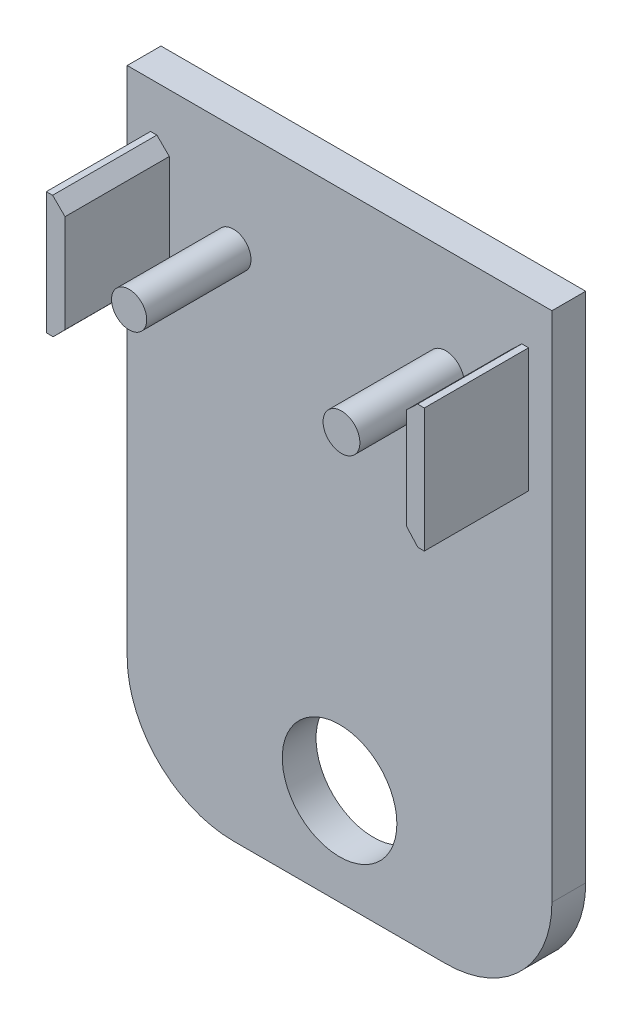
ISO-10303-21;
HEADER;
FILE_DESCRIPTION(('STEP AP214'),'2;1');
FILE_NAME('part.step','',(''),(''),'','','');
FILE_SCHEMA(('AUTOMOTIVE_DESIGN { 1 0 10303 214 1 1 1 1 }'));
ENDSEC;
DATA;
#1=APPLICATION_CONTEXT('core data for automotive mechanical design processes');
#2=APPLICATION_PROTOCOL_DEFINITION('international standard','automotive_design',2000,#1);
#3=PRODUCT_CONTEXT('',#1,'mechanical');
#4=PRODUCT('Part','Part','',(#3));
#5=PRODUCT_RELATED_PRODUCT_CATEGORY('part','',(#4));
#6=PRODUCT_DEFINITION_FORMATION('','',#4);
#7=PRODUCT_DEFINITION_CONTEXT('part definition',#1,'design');
#8=PRODUCT_DEFINITION('design','',#6,#7);
#9=PRODUCT_DEFINITION_SHAPE('','',#8);
#10=(LENGTH_UNIT() NAMED_UNIT(*) SI_UNIT(.MILLI.,.METRE.));
#11=(NAMED_UNIT(*) PLANE_ANGLE_UNIT() SI_UNIT($,.RADIAN.));
#12=(NAMED_UNIT(*) SI_UNIT($,.STERADIAN.) SOLID_ANGLE_UNIT());
#13=UNCERTAINTY_MEASURE_WITH_UNIT(LENGTH_MEASURE(1.E-05),#10,'distance_accuracy_value','');
#14=(GEOMETRIC_REPRESENTATION_CONTEXT(3) GLOBAL_UNCERTAINTY_ASSIGNED_CONTEXT((#13)) GLOBAL_UNIT_ASSIGNED_CONTEXT((#10,
#11,#12)) REPRESENTATION_CONTEXT('',''));
#15=CARTESIAN_POINT('',(0.,0.,0.));
#16=DIRECTION('',(0.,0.,1.));
#17=DIRECTION('',(1.,0.,0.));
#18=AXIS2_PLACEMENT_3D('',#15,#16,#17);
#19=CARTESIAN_POINT('',(-76.99999999992,-58.2594600658297,-21.5237040059095));
#20=DIRECTION('',(-1.,0.,0.));
#21=DIRECTION('',(0.,0.,1.));
#22=AXIS2_PLACEMENT_3D('',#19,#20,#21);
#23=PLANE('',#22);
#24=DIRECTION('',(0.,-1.,0.));
#25=VECTOR('',#24,1.);
#26=CARTESIAN_POINT('',(-76.99999999992,-58.2594600658297,-21.5237040059095));
#27=LINE('',#26,#25);
#28=CARTESIAN_POINT('',(-76.99999999992,-1.2700105598179E-09,-21.5237040059095));
#29=VERTEX_POINT('',#28);
#30=CARTESIAN_POINT('',(-76.99999999992,-48.2594600658297,-21.5237040059095));
#31=VERTEX_POINT('',#30);
#32=EDGE_CURVE('E252',#29,#31,#27,.T.);
#33=ORIENTED_EDGE('',*,*,#32,.T.);
#34=DIRECTION('',(0.,0.,1.));
#35=VECTOR('',#34,1.);
#36=CARTESIAN_POINT('',(-76.99999999992,-48.2594600658297,-21.5237040059095));
#37=LINE('',#36,#35);
#38=CARTESIAN_POINT('',(-76.99999999992,-48.2594600658297,-18.3437040059095));
#39=VERTEX_POINT('',#38);
#40=EDGE_CURVE('E293',#31,#39,#37,.T.);
#41=ORIENTED_EDGE('',*,*,#40,.T.);
#42=DIRECTION('',(0.,-1.,0.));
#43=VECTOR('',#42,1.);
#44=CARTESIAN_POINT('',(-76.99999999992,-58.2594600658297,-18.3437040059095));
#45=LINE('',#44,#43);
#46=CARTESIAN_POINT('',(-76.99999999992,-1.2700105598179E-09,-18.3437040059095));
#47=VERTEX_POINT('',#46);
#48=EDGE_CURVE('E249',#47,#39,#45,.T.);
#49=ORIENTED_EDGE('',*,*,#48,.F.);
#50=DIRECTION('',(0.,0.,1.));
#51=VECTOR('',#50,1.);
#52=CARTESIAN_POINT('',(-76.99999999992,-1.2700105598179E-09,-21.5237040059095));
#53=LINE('',#52,#51);
#54=EDGE_CURVE('E274',#29,#47,#53,.T.);
#55=ORIENTED_EDGE('',*,*,#54,.F.);
#56=EDGE_LOOP('',(#33,#41,#49,#55));
#57=FACE_BOUND('',#56,.T.);
#58=ADVANCED_FACE('F35',(#57),#23,.T.);
#59=CARTESIAN_POINT('',(-37.00000000008,-1.27000617095487E-09,-21.5237040059095));
#60=DIRECTION('',(0.,1.,0.));
#61=DIRECTION('',(-1.,0.,0.));
#62=AXIS2_PLACEMENT_3D('',#59,#60,#61);
#63=PLANE('',#62);
#64=DIRECTION('',(-1.,0.,0.));
#65=VECTOR('',#64,1.);
#66=CARTESIAN_POINT('',(-37.00000000008,-1.27000617095487E-09,-18.3437040059095));
#67=LINE('',#66,#65);
#68=CARTESIAN_POINT('',(-37.00000000008,-1.27000617095487E-09,-18.3437040059095));
#69=VERTEX_POINT('',#68);
#70=EDGE_CURVE('E256',#69,#47,#67,.T.);
#71=ORIENTED_EDGE('',*,*,#70,.F.);
#72=DIRECTION('',(0.,0.,1.));
#73=VECTOR('',#72,1.);
#74=CARTESIAN_POINT('',(-37.00000000008,-1.27000617095487E-09,-21.5237040059095));
#75=LINE('',#74,#73);
#76=CARTESIAN_POINT('',(-37.00000000008,-1.27000617095487E-09,-21.5237040059095));
#77=VERTEX_POINT('',#76);
#78=EDGE_CURVE('E264',#77,#69,#75,.T.);
#79=ORIENTED_EDGE('',*,*,#78,.F.);
#80=DIRECTION('',(-1.,0.,0.));
#81=VECTOR('',#80,1.);
#82=CARTESIAN_POINT('',(-37.00000000008,-1.27000617095487E-09,-21.5237040059095));
#83=LINE('',#82,#81);
#84=EDGE_CURVE('E261',#77,#29,#83,.T.);
#85=ORIENTED_EDGE('',*,*,#84,.T.);
#86=ORIENTED_EDGE('',*,*,#54,.T.);
#87=EDGE_LOOP('',(#71,#79,#85,#86));
#88=FACE_BOUND('',#87,.T.);
#89=ADVANCED_FACE('F367',(#88),#63,.T.);
#90=CARTESIAN_POINT('',(-37.00000000008,-58.2594600658297,-21.5237040059095));
#91=DIRECTION('',(1.,0.,0.));
#92=DIRECTION('',(0.,0.,-1.));
#93=AXIS2_PLACEMENT_3D('',#90,#91,#92);
#94=PLANE('',#93);
#95=DIRECTION('',(0.,1.,0.));
#96=VECTOR('',#95,1.);
#97=CARTESIAN_POINT('',(-37.00000000008,-58.2594600658297,-18.3437040059095));
#98=LINE('',#97,#96);
#99=CARTESIAN_POINT('',(-37.00000000008,-48.2594600658297,-18.3437040059095));
#100=VERTEX_POINT('',#99);
#101=EDGE_CURVE('E270',#100,#69,#98,.T.);
#102=ORIENTED_EDGE('',*,*,#101,.F.);
#103=DIRECTION('',(0.,0.,1.));
#104=VECTOR('',#103,1.);
#105=CARTESIAN_POINT('',(-37.00000000008,-48.2594600658297,-21.5237040059095));
#106=LINE('',#105,#104);
#107=CARTESIAN_POINT('',(-37.00000000008,-48.2594600658297,-21.5237040059095));
#108=VERTEX_POINT('',#107);
#109=EDGE_CURVE('E287',#100,#108,#106,.F.);
#110=ORIENTED_EDGE('',*,*,#109,.T.);
#111=DIRECTION('',(0.,1.,0.));
#112=VECTOR('',#111,1.);
#113=CARTESIAN_POINT('',(-37.00000000008,-58.2594600658297,-21.5237040059095));
#114=LINE('',#113,#112);
#115=EDGE_CURVE('E259',#108,#77,#114,.T.);
#116=ORIENTED_EDGE('',*,*,#115,.T.);
#117=ORIENTED_EDGE('',*,*,#78,.T.);
#118=EDGE_LOOP('',(#102,#110,#116,#117));
#119=FACE_BOUND('',#118,.T.);
#120=ADVANCED_FACE('F374',(#119),#94,.T.);
#121=CARTESIAN_POINT('',(-37.00000000008,-58.2594600658297,-21.5237040059095));
#122=DIRECTION('',(0.,-1.,0.));
#123=DIRECTION('',(1.,0.,0.));
#124=AXIS2_PLACEMENT_3D('',#121,#122,#123);
#125=PLANE('',#124);
#126=DIRECTION('',(1.,0.,0.));
#127=VECTOR('',#126,1.);
#128=CARTESIAN_POINT('',(-37.00000000008,-58.2594600658297,-21.5237040059095));
#129=LINE('',#128,#127);
#130=CARTESIAN_POINT('',(-66.99999999992,-58.2594600658297,-21.5237040059095));
#131=VERTEX_POINT('',#130);
#132=CARTESIAN_POINT('',(-47.00000000008,-58.2594600658297,-21.5237040059095));
#133=VERTEX_POINT('',#132);
#134=EDGE_CURVE('E255',#131,#133,#129,.T.);
#135=ORIENTED_EDGE('',*,*,#134,.T.);
#136=DIRECTION('',(0.,0.,1.));
#137=VECTOR('',#136,1.);
#138=CARTESIAN_POINT('',(-47.00000000008,-58.2594600658297,-21.5237040059095));
#139=LINE('',#138,#137);
#140=CARTESIAN_POINT('',(-47.00000000008,-58.2594600658297,-18.3437040059095));
#141=VERTEX_POINT('',#140);
#142=EDGE_CURVE('E280',#133,#141,#139,.T.);
#143=ORIENTED_EDGE('',*,*,#142,.T.);
#144=DIRECTION('',(1.,0.,0.));
#145=VECTOR('',#144,1.);
#146=CARTESIAN_POINT('',(-37.00000000008,-58.2594600658297,-18.3437040059095));
#147=LINE('',#146,#145);
#148=CARTESIAN_POINT('',(-66.99999999992,-58.2594600658297,-18.3437040059095));
#149=VERTEX_POINT('',#148);
#150=EDGE_CURVE('E267',#149,#141,#147,.T.);
#151=ORIENTED_EDGE('',*,*,#150,.F.);
#152=DIRECTION('',(0.,0.,1.));
#153=VECTOR('',#152,1.);
#154=CARTESIAN_POINT('',(-66.99999999992,-58.2594600658297,-21.5237040059095));
#155=LINE('',#154,#153);
#156=EDGE_CURVE('E276',#149,#131,#155,.F.);
#157=ORIENTED_EDGE('',*,*,#156,.T.);
#158=EDGE_LOOP('',(#135,#143,#151,#157));
#159=FACE_BOUND('',#158,.T.);
#160=ADVANCED_FACE('F353',(#159),#125,.T.);
#161=CARTESIAN_POINT('',(0.,0.,-21.5237040059095));
#162=DIRECTION('',(0.,0.,1.));
#163=DIRECTION('',(1.,0.,0.));
#164=AXIS2_PLACEMENT_3D('',#161,#162,#163);
#165=PLANE('',#164);
#166=CARTESIAN_POINT('',(-56.9999999999199,-49.15000000246,-21.5237040059095));
#167=DIRECTION('',(0.,0.,1.));
#168=DIRECTION('',(1.,0.,0.));
#169=AXIS2_PLACEMENT_3D('',#166,#167,#168);
#170=CIRCLE('',#169,5.39638174686251);
#171=CARTESIAN_POINT('',(-51.6036182530574,-49.15000000246,-21.5237040059095));
#172=VERTEX_POINT('',#171);
#173=EDGE_CURVE('E246',#172,#172,#170,.T.);
#174=ORIENTED_EDGE('',*,*,#173,.T.);
#175=EDGE_LOOP('',(#174));
#176=FACE_BOUND('',#175,.T.);
#177=ORIENTED_EDGE('',*,*,#115,.F.);
#178=CARTESIAN_POINT('',(-47.00000000008,-48.2594600658297,-21.5237040059095));
#179=DIRECTION('',(0.,0.,1.));
#180=DIRECTION('',(1.,0.,0.));
#181=AXIS2_PLACEMENT_3D('',#178,#179,#180);
#182=CIRCLE('',#181,10.);
#183=EDGE_CURVE('E291',#108,#133,#182,.F.);
#184=ORIENTED_EDGE('',*,*,#183,.T.);
#185=ORIENTED_EDGE('',*,*,#134,.F.);
#186=CARTESIAN_POINT('',(-66.99999999992,-48.2594600658297,-21.5237040059095));
#187=DIRECTION('',(0.,0.,1.));
#188=DIRECTION('',(1.,0.,0.));
#189=AXIS2_PLACEMENT_3D('',#186,#187,#188);
#190=CIRCLE('',#189,10.);
#191=EDGE_CURVE('E289',#131,#31,#190,.F.);
#192=ORIENTED_EDGE('',*,*,#191,.T.);
#193=ORIENTED_EDGE('',*,*,#32,.F.);
#194=ORIENTED_EDGE('',*,*,#84,.F.);
#195=EDGE_LOOP('',(#177,#184,#185,#192,#193,#194));
#196=FACE_BOUND('',#195,.T.);
#197=ADVANCED_FACE('F340',(#176,#196),#165,.F.);
#198=CARTESIAN_POINT('',(0.,0.,-18.3437040059095));
#199=DIRECTION('',(0.,0.,1.));
#200=DIRECTION('',(1.,0.,0.));
#201=AXIS2_PLACEMENT_3D('',#198,#199,#200);
#202=PLANE('',#201);
#203=DIRECTION('',(1.,0.,0.));
#204=VECTOR('',#203,1.);
#205=CARTESIAN_POINT('',(0.,-15.7965085304937,-18.3437040059095));
#206=LINE('',#205,#204);
#207=CARTESIAN_POINT('',(-39.8070517777392,-15.7965085304937,-18.3437040059095));
#208=VERTEX_POINT('',#207);
#209=CARTESIAN_POINT('',(-39.1984918650404,-15.7965085304937,-18.3437040059095));
#210=VERTEX_POINT('',#209);
#211=EDGE_CURVE('E11',#208,#210,#206,.T.);
#212=ORIENTED_EDGE('',*,*,#211,.F.);
#213=DIRECTION('',(0.670178191628452,-0.742200236772812,0.));
#214=VECTOR('',#213,1.);
#215=CARTESIAN_POINT('',(-29.7854446093019,-26.8951078376194,-18.3437040059095));
#216=LINE('',#215,#214);
#217=CARTESIAN_POINT('',(-40.8707929518651,-14.6184502749978,-18.3437040059095));
#218=VERTEX_POINT('',#217);
#219=EDGE_CURVE('E162',#218,#208,#216,.T.);
#220=ORIENTED_EDGE('',*,*,#219,.F.);
#221=DIRECTION('',(0.,-1.,0.));
#222=VECTOR('',#221,1.);
#223=CARTESIAN_POINT('',(-40.8707929518651,0.,-18.3437040059095));
#224=LINE('',#223,#222);
#225=CARTESIAN_POINT('',(-40.8707929518651,-5.11185736035692,-18.3437040059095));
#226=VERTEX_POINT('',#225);
#227=EDGE_CURVE('E321',#226,#218,#224,.T.);
#228=ORIENTED_EDGE('',*,*,#227,.F.);
#229=DIRECTION('',(-0.722651085589135,-0.69121299792238,0.));
#230=VECTOR('',#229,1.);
#231=CARTESIAN_POINT('',(-16.973657278678,17.7456614614067,-18.3437040059095));
#232=LINE('',#231,#230);
#233=CARTESIAN_POINT('',(-39.8363676381332,-4.12243350631463,-18.3437040059095));
#234=VERTEX_POINT('',#233);
#235=EDGE_CURVE('E324',#234,#226,#232,.T.);
#236=ORIENTED_EDGE('',*,*,#235,.F.);
#237=DIRECTION('',(-1.,0.,0.));
#238=VECTOR('',#237,1.);
#239=CARTESIAN_POINT('',(0.,-4.1224335063148,-18.3437040059095));
#240=LINE('',#239,#238);
#241=CARTESIAN_POINT('',(-39.1984918650404,-4.12243350631464,-18.3437040059095));
#242=VERTEX_POINT('',#241);
#243=EDGE_CURVE('E53',#242,#234,#240,.T.);
#244=ORIENTED_EDGE('',*,*,#243,.F.);
#245=DIRECTION('',(0.,1.,0.));
#246=VECTOR('',#245,1.);
#247=CARTESIAN_POINT('',(-39.1984918650404,0.,-18.3437040059095));
#248=LINE('',#247,#246);
#249=EDGE_CURVE('E43',#210,#242,#248,.T.);
#250=ORIENTED_EDGE('',*,*,#249,.F.);
#251=EDGE_LOOP('',(#212,#220,#228,#236,#244,#250));
#252=FACE_BOUND('',#251,.T.);
#253=DIRECTION('',(1.,0.,0.));
#254=VECTOR('',#253,1.);
#255=CARTESIAN_POINT('',(0.,-15.7965085304937,-18.3437040059095));
#256=LINE('',#255,#254);
#257=CARTESIAN_POINT('',(-74.8006851749591,-15.7965085304937,-18.3437040059095));
#258=VERTEX_POINT('',#257);
#259=CARTESIAN_POINT('',(-74.1567615058609,-15.7965085304937,-18.3437040059095));
#260=VERTEX_POINT('',#259);
#261=EDGE_CURVE('E317',#258,#260,#256,.T.);
#262=ORIENTED_EDGE('',*,*,#261,.F.);
#263=DIRECTION('',(0.,-1.,0.));
#264=VECTOR('',#263,1.);
#265=CARTESIAN_POINT('',(-74.8006851749591,0.,-18.3437040059095));
#266=LINE('',#265,#264);
#267=CARTESIAN_POINT('',(-74.8006851749591,-4.27867641610968,-18.3437040059095));
#268=VERTEX_POINT('',#267);
#269=EDGE_CURVE('E302',#268,#258,#266,.T.);
#270=ORIENTED_EDGE('',*,*,#269,.F.);
#271=DIRECTION('',(-1.,0.,0.));
#272=VECTOR('',#271,1.);
#273=CARTESIAN_POINT('',(0.,-4.27867641610968,-18.3437040059095));
#274=LINE('',#273,#272);
#275=CARTESIAN_POINT('',(-74.2072392554148,-4.27867641610968,-18.3437040059095));
#276=VERTEX_POINT('',#275);
#277=EDGE_CURVE('E305',#276,#268,#274,.T.);
#278=ORIENTED_EDGE('',*,*,#277,.F.);
#279=DIRECTION('',(-0.710877936542844,0.703315405303047,0.));
#280=VECTOR('',#279,1.);
#281=CARTESIAN_POINT('',(-38.8460166742769,-39.2637157783003,-18.3437040059095));
#282=LINE('',#281,#280);
#283=CARTESIAN_POINT('',(-73.0355807830709,-5.43787043662018,-18.3437040059095));
#284=VERTEX_POINT('',#283);
#285=EDGE_CURVE('E308',#284,#276,#282,.T.);
#286=ORIENTED_EDGE('',*,*,#285,.F.);
#287=DIRECTION('',(0.,1.,0.));
#288=VECTOR('',#287,1.);
#289=CARTESIAN_POINT('',(-73.0355807830709,0.,-18.3437040059095));
#290=LINE('',#289,#288);
#291=CARTESIAN_POINT('',(-73.0355807830709,-14.6632721010072,-18.3437040059095));
#292=VERTEX_POINT('',#291);
#293=EDGE_CURVE('E311',#292,#284,#290,.T.);
#294=ORIENTED_EDGE('',*,*,#293,.F.);
#295=DIRECTION('',(0.703315405303047,0.710877936542843,0.));
#296=VECTOR('',#295,1.);
#297=CARTESIAN_POINT('',(-29.5771270856271,29.262476797483,-18.3437040059095));
#298=LINE('',#297,#296);
#299=EDGE_CURVE('E314',#260,#292,#298,.T.);
#300=ORIENTED_EDGE('',*,*,#299,.F.);
#301=EDGE_LOOP('',(#262,#270,#278,#286,#294,#300));
#302=FACE_BOUND('',#301,.T.);
#303=CARTESIAN_POINT('',(-67.0003767391349,-10.0003603508643,-18.3437040059095));
#304=DIRECTION('',(0.,0.,1.));
#305=DIRECTION('',(1.,0.,0.));
#306=AXIS2_PLACEMENT_3D('',#303,#304,#305);
#307=CIRCLE('',#306,1.65677954446755);
#308=CARTESIAN_POINT('',(-65.3435971946673,-10.0003603508643,-18.3437040059095));
#309=VERTEX_POINT('',#308);
#310=EDGE_CURVE('E299',#309,#309,#307,.T.);
#311=ORIENTED_EDGE('',*,*,#310,.F.);
#312=EDGE_LOOP('',(#311));
#313=FACE_BOUND('',#312,.T.);
#314=CARTESIAN_POINT('',(-47.00000000131,-10.0000000025,-18.3437040059095));
#315=DIRECTION('',(0.,0.,1.));
#316=DIRECTION('',(1.,0.,0.));
#317=AXIS2_PLACEMENT_3D('',#314,#315,#316);
#318=CIRCLE('',#317,1.73500809325514);
#319=CARTESIAN_POINT('',(-45.2649919080548,-10.0000000025,-18.3437040059095));
#320=VERTEX_POINT('',#319);
#321=EDGE_CURVE('E296',#320,#320,#318,.T.);
#322=ORIENTED_EDGE('',*,*,#321,.F.);
#323=EDGE_LOOP('',(#322));
#324=FACE_BOUND('',#323,.T.);
#325=CARTESIAN_POINT('',(-56.9999999999199,-49.15000000246,-18.3437040059095));
#326=DIRECTION('',(0.,0.,1.));
#327=DIRECTION('',(1.,0.,0.));
#328=AXIS2_PLACEMENT_3D('',#325,#326,#327);
#329=CIRCLE('',#328,5.39638174686251);
#330=CARTESIAN_POINT('',(-51.6036182530574,-49.15000000246,-18.3437040059095));
#331=VERTEX_POINT('',#330);
#332=EDGE_CURVE('E245',#331,#331,#329,.T.);
#333=ORIENTED_EDGE('',*,*,#332,.F.);
#334=EDGE_LOOP('',(#333));
#335=FACE_BOUND('',#334,.T.);
#336=ORIENTED_EDGE('',*,*,#150,.T.);
#337=CARTESIAN_POINT('',(-47.00000000008,-48.2594600658297,-18.3437040059095));
#338=DIRECTION('',(0.,0.,1.));
#339=DIRECTION('',(1.,0.,0.));
#340=AXIS2_PLACEMENT_3D('',#337,#338,#339);
#341=CIRCLE('',#340,10.);
#342=EDGE_CURVE('E285',#141,#100,#341,.T.);
#343=ORIENTED_EDGE('',*,*,#342,.T.);
#344=ORIENTED_EDGE('',*,*,#101,.T.);
#345=ORIENTED_EDGE('',*,*,#70,.T.);
#346=ORIENTED_EDGE('',*,*,#48,.T.);
#347=CARTESIAN_POINT('',(-66.99999999992,-48.2594600658297,-18.3437040059095));
#348=DIRECTION('',(0.,0.,1.));
#349=DIRECTION('',(1.,0.,0.));
#350=AXIS2_PLACEMENT_3D('',#347,#348,#349);
#351=CIRCLE('',#350,10.);
#352=EDGE_CURVE('E283',#39,#149,#351,.T.);
#353=ORIENTED_EDGE('',*,*,#352,.T.);
#354=EDGE_LOOP('',(#336,#343,#344,#345,#346,#353));
#355=FACE_BOUND('',#354,.T.);
#356=ADVANCED_FACE('F336',(#252,#302,#313,#324,#335,#355),#202,.T.);
#357=CARTESIAN_POINT('',(-56.9999999999199,-49.15000000246,-21.5237040059095));
#358=DIRECTION('',(0.,0.,1.));
#359=DIRECTION('',(1.,0.,0.));
#360=AXIS2_PLACEMENT_3D('',#357,#358,#359);
#361=CYLINDRICAL_SURFACE('',#360,5.39638174686251);
#362=CARTESIAN_POINT('',(-51.6036182530574,-49.15000000246,-21.5237040059095));
#363=CARTESIAN_POINT('',(-51.6036182530574,-49.15000000246,-21.4905790059095));
#364=CARTESIAN_POINT('',(-51.6036182530574,-49.15000000246,-21.4574540059095));
#365=CARTESIAN_POINT('',(-51.6036182530574,-49.15000000246,-21.3912040059095));
#366=CARTESIAN_POINT('',(-51.6036182530574,-49.15000000246,-21.3580790059095));
#367=CARTESIAN_POINT('',(-51.6036182530574,-49.15000000246,-21.2918290059095));
#368=CARTESIAN_POINT('',(-51.6036182530574,-49.15000000246,-21.2587040059095));
#369=CARTESIAN_POINT('',(-51.6036182530574,-49.15000000246,-21.1924540059095));
#370=CARTESIAN_POINT('',(-51.6036182530574,-49.15000000246,-21.1593290059095));
#371=CARTESIAN_POINT('',(-51.6036182530574,-49.15000000246,-21.0930790059095));
#372=CARTESIAN_POINT('',(-51.6036182530574,-49.15000000246,-21.0599540059095));
#373=CARTESIAN_POINT('',(-51.6036182530574,-49.15000000246,-20.9937040059095));
#374=CARTESIAN_POINT('',(-51.6036182530574,-49.15000000246,-20.9605790059095));
#375=CARTESIAN_POINT('',(-51.6036182530574,-49.15000000246,-20.8943290059095));
#376=CARTESIAN_POINT('',(-51.6036182530574,-49.15000000246,-20.8612040059095));
#377=CARTESIAN_POINT('',(-51.6036182530574,-49.15000000246,-20.7949540059095));
#378=CARTESIAN_POINT('',(-51.6036182530574,-49.15000000246,-20.7618290059095));
#379=CARTESIAN_POINT('',(-51.6036182530574,-49.15000000246,-20.6955790059095));
#380=CARTESIAN_POINT('',(-51.6036182530574,-49.15000000246,-20.6624540059095));
#381=CARTESIAN_POINT('',(-51.6036182530574,-49.15000000246,-20.5962040059095));
#382=CARTESIAN_POINT('',(-51.6036182530574,-49.15000000246,-20.5630790059095));
#383=CARTESIAN_POINT('',(-51.6036182530574,-49.15000000246,-20.4968290059095));
#384=CARTESIAN_POINT('',(-51.6036182530574,-49.15000000246,-20.4637040059095));
#385=CARTESIAN_POINT('',(-51.6036182530574,-49.15000000246,-20.3974540059095));
#386=CARTESIAN_POINT('',(-51.6036182530574,-49.15000000246,-20.3643290059095));
#387=CARTESIAN_POINT('',(-51.6036182530574,-49.15000000246,-20.2980790059095));
#388=CARTESIAN_POINT('',(-51.6036182530574,-49.15000000246,-20.2649540059095));
#389=CARTESIAN_POINT('',(-51.6036182530574,-49.15000000246,-20.1987040059095));
#390=CARTESIAN_POINT('',(-51.6036182530574,-49.15000000246,-20.1655790059095));
#391=CARTESIAN_POINT('',(-51.6036182530574,-49.15000000246,-20.0993290059095));
#392=CARTESIAN_POINT('',(-51.6036182530574,-49.15000000246,-20.0662040059095));
#393=CARTESIAN_POINT('',(-51.6036182530574,-49.15000000246,-19.9999540059095));
#394=CARTESIAN_POINT('',(-51.6036182530574,-49.15000000246,-19.9668290059095));
#395=CARTESIAN_POINT('',(-51.6036182530574,-49.15000000246,-19.9005790059095));
#396=CARTESIAN_POINT('',(-51.6036182530574,-49.15000000246,-19.8674540059095));
#397=CARTESIAN_POINT('',(-51.6036182530574,-49.15000000246,-19.8012040059095));
#398=CARTESIAN_POINT('',(-51.6036182530574,-49.15000000246,-19.7680790059095));
#399=CARTESIAN_POINT('',(-51.6036182530574,-49.15000000246,-19.7018290059095));
#400=CARTESIAN_POINT('',(-51.6036182530574,-49.15000000246,-19.6687040059095));
#401=CARTESIAN_POINT('',(-51.6036182530574,-49.15000000246,-19.6024540059095));
#402=CARTESIAN_POINT('',(-51.6036182530574,-49.15000000246,-19.5693290059095));
#403=CARTESIAN_POINT('',(-51.6036182530574,-49.15000000246,-19.5030790059095));
#404=CARTESIAN_POINT('',(-51.6036182530574,-49.15000000246,-19.4699540059095));
#405=CARTESIAN_POINT('',(-51.6036182530574,-49.15000000246,-19.4037040059095));
#406=CARTESIAN_POINT('',(-51.6036182530574,-49.15000000246,-19.3705790059095));
#407=CARTESIAN_POINT('',(-51.6036182530574,-49.15000000246,-19.3043290059095));
#408=CARTESIAN_POINT('',(-51.6036182530574,-49.15000000246,-19.2712040059095));
#409=CARTESIAN_POINT('',(-51.6036182530574,-49.15000000246,-19.2049540059095));
#410=CARTESIAN_POINT('',(-51.6036182530574,-49.15000000246,-19.1718290059095));
#411=CARTESIAN_POINT('',(-51.6036182530574,-49.15000000246,-19.1055790059095));
#412=CARTESIAN_POINT('',(-51.6036182530574,-49.15000000246,-19.0724540059095));
#413=CARTESIAN_POINT('',(-51.6036182530574,-49.15000000246,-19.0062040059095));
#414=CARTESIAN_POINT('',(-51.6036182530574,-49.15000000246,-18.9730790059095));
#415=CARTESIAN_POINT('',(-51.6036182530574,-49.15000000246,-18.9068290059095));
#416=CARTESIAN_POINT('',(-51.6036182530574,-49.15000000246,-18.8737040059095));
#417=CARTESIAN_POINT('',(-51.6036182530574,-49.15000000246,-18.8074540059095));
#418=CARTESIAN_POINT('',(-51.6036182530574,-49.15000000246,-18.7743290059095));
#419=CARTESIAN_POINT('',(-51.6036182530574,-49.15000000246,-18.7080790059095));
#420=CARTESIAN_POINT('',(-51.6036182530574,-49.15000000246,-18.6749540059095));
#421=CARTESIAN_POINT('',(-51.6036182530574,-49.15000000246,-18.6087040059095));
#422=CARTESIAN_POINT('',(-51.6036182530574,-49.15000000246,-18.5755790059095));
#423=CARTESIAN_POINT('',(-51.6036182530574,-49.15000000246,-18.5093290059095));
#424=CARTESIAN_POINT('',(-51.6036182530574,-49.15000000246,-18.4762040059095));
#425=CARTESIAN_POINT('',(-51.6036182530574,-49.15000000246,-18.4099540059095));
#426=CARTESIAN_POINT('',(-51.6036182530574,-49.15000000246,-18.3768290059095));
#427=CARTESIAN_POINT('',(-51.6036182530574,-49.15000000246,-18.3437040059095));
#428=B_SPLINE_CURVE_WITH_KNOTS('',3,(#362,#363,#364,#365,#366,#367,#368,#369,#370,#371,#372,
#373,#374,#375,#376,#377,#378,#379,#380,#381,#382,#383,#384,#385,#386,#387,#388,#389,#390,#391,
#392,#393,#394,#395,#396,#397,#398,#399,#400,#401,#402,#403,#404,#405,#406,#407,#408,#409,#410,
#411,#412,#413,#414,#415,#416,#417,#418,#419,#420,#421,#422,#423,#424,#425,#426,#427),
.UNSPECIFIED.,.F.,.F.,(4,2,2,2,2,2,2,2,2,2,2,2,2,2,2,2,2,2,2,2,2,2,2,2,2,2,2,2,2,2,2,2,4),(0.,
0.0993750000000022,0.198750000000001,0.298125000000003,0.397500000000002,0.496875000000001,
0.596250000000003,0.695625000000002,0.795000000000001,0.894375000000003,0.993750000000002,
1.093125,1.1925,1.291875,1.39125,1.490625,1.59,1.689375,1.78875,1.888125,1.9875,2.086875,
2.18625,2.285625,2.385,2.484375,2.58375,2.683125,2.7825,2.881875,2.98125,3.080625,3.18),.UNSPECIFIED.);
#429=EDGE_CURVE('BSEAM339',#172,#331,#428,.T.);
#430=ORIENTED_EDGE('',*,*,#173,.F.);
#431=ORIENTED_EDGE('',*,*,#332,.T.);
#432=ORIENTED_EDGE('',*,*,#429,.T.);
#433=ORIENTED_EDGE('',*,*,#429,.F.);
#434=EDGE_LOOP('',(#430,#432,#431,#433));
#435=FACE_BOUND('',#434,.T.);
#436=ADVANCED_FACE('F339',(#435),#361,.F.);
#437=CARTESIAN_POINT('',(-47.00000000008,-48.2594600658297,-21.5237040059095));
#438=DIRECTION('',(0.,0.,1.));
#439=DIRECTION('',(1.,0.,0.));
#440=AXIS2_PLACEMENT_3D('',#437,#438,#439);
#441=CYLINDRICAL_SURFACE('',#440,10.);
#442=ORIENTED_EDGE('',*,*,#183,.F.);
#443=ORIENTED_EDGE('',*,*,#109,.F.);
#444=ORIENTED_EDGE('',*,*,#342,.F.);
#445=ORIENTED_EDGE('',*,*,#142,.F.);
#446=EDGE_LOOP('',(#442,#443,#444,#445));
#447=FACE_BOUND('',#446,.T.);
#448=ADVANCED_FACE('F373',(#447),#441,.T.);
#449=CARTESIAN_POINT('',(-66.99999999992,-48.2594600658297,-21.5237040059095));
#450=DIRECTION('',(0.,0.,1.));
#451=DIRECTION('',(1.,0.,0.));
#452=AXIS2_PLACEMENT_3D('',#449,#450,#451);
#453=CYLINDRICAL_SURFACE('',#452,10.);
#454=ORIENTED_EDGE('',*,*,#191,.F.);
#455=ORIENTED_EDGE('',*,*,#156,.F.);
#456=ORIENTED_EDGE('',*,*,#352,.F.);
#457=ORIENTED_EDGE('',*,*,#40,.F.);
#458=EDGE_LOOP('',(#454,#455,#456,#457));
#459=FACE_BOUND('',#458,.T.);
#460=ADVANCED_FACE('F37',(#459),#453,.T.);
#461=CARTESIAN_POINT('',(-47.00000000131,-10.0000000025,-8.52370400590945));
#462=DIRECTION('',(0.,0.,-1.));
#463=DIRECTION('',(-1.,0.,0.));
#464=AXIS2_PLACEMENT_3D('',#461,#462,#463);
#465=CYLINDRICAL_SURFACE('',#464,1.73500809325514);
#466=ORIENTED_EDGE('',*,*,#321,.T.);
#467=EDGE_LOOP('',(#466));
#468=FACE_BOUND('',#467,.T.);
#469=CARTESIAN_POINT('',(-47.00000000131,-10.0000000025,-8.52370400590945));
#470=DIRECTION('',(0.,0.,-1.));
#471=DIRECTION('',(-1.,0.,0.));
#472=AXIS2_PLACEMENT_3D('',#469,#470,#471);
#473=CIRCLE('',#472,1.73500809325514);
#474=CARTESIAN_POINT('',(-48.7350080945651,-10.0000000025,-8.52370400590945));
#475=VERTEX_POINT('',#474);
#476=EDGE_CURVE('E242',#475,#475,#473,.T.);
#477=ORIENTED_EDGE('',*,*,#476,.T.);
#478=EDGE_LOOP('',(#477));
#479=FACE_BOUND('',#478,.T.);
#480=ADVANCED_FACE('F392',(#468,#479),#465,.T.);
#481=CARTESIAN_POINT('',(-47.00000000131,-10.0000000025,-8.52370400590945));
#482=DIRECTION('',(0.,0.,-1.));
#483=DIRECTION('',(-1.,0.,0.));
#484=AXIS2_PLACEMENT_3D('',#481,#482,#483);
#485=PLANE('',#484);
#486=ORIENTED_EDGE('',*,*,#476,.F.);
#487=EDGE_LOOP('',(#486));
#488=FACE_BOUND('',#487,.T.);
#489=ADVANCED_FACE('F423',(#488),#485,.F.);
#490=CARTESIAN_POINT('',(-67.0003767391349,-10.0003603508643,-8.52370400590945));
#491=DIRECTION('',(0.,0.,-1.));
#492=DIRECTION('',(-1.,0.,0.));
#493=AXIS2_PLACEMENT_3D('',#490,#491,#492);
#494=CYLINDRICAL_SURFACE('',#493,1.65677954446755);
#495=ORIENTED_EDGE('',*,*,#310,.T.);
#496=EDGE_LOOP('',(#495));
#497=FACE_BOUND('',#496,.T.);
#498=CARTESIAN_POINT('',(-67.0003767391349,-10.0003603508643,-8.52370400590945));
#499=DIRECTION('',(0.,0.,-1.));
#500=DIRECTION('',(-1.,0.,0.));
#501=AXIS2_PLACEMENT_3D('',#498,#499,#500);
#502=CIRCLE('',#501,1.65677954446755);
#503=CARTESIAN_POINT('',(-68.6571562836024,-10.0003603508643,-8.52370400590945));
#504=VERTEX_POINT('',#503);
#505=EDGE_CURVE('E225',#504,#504,#502,.T.);
#506=ORIENTED_EDGE('',*,*,#505,.T.);
#507=EDGE_LOOP('',(#506));
#508=FACE_BOUND('',#507,.T.);
#509=ADVANCED_FACE('F433',(#497,#508),#494,.T.);
#510=CARTESIAN_POINT('',(-67.0003767391349,-10.0003603508643,-8.52370400590945));
#511=DIRECTION('',(0.,0.,-1.));
#512=DIRECTION('',(-1.,0.,0.));
#513=AXIS2_PLACEMENT_3D('',#510,#511,#512);
#514=PLANE('',#513);
#515=ORIENTED_EDGE('',*,*,#505,.F.);
#516=EDGE_LOOP('',(#515));
#517=FACE_BOUND('',#516,.T.);
#518=ADVANCED_FACE('F442',(#517),#514,.F.);
#519=CARTESIAN_POINT('',(-74.1567615058609,-15.7965085304937,-8.52370400590945));
#520=DIRECTION('',(0.,-1.,0.));
#521=DIRECTION('',(0.,0.,-1.));
#522=AXIS2_PLACEMENT_3D('',#519,#520,#521);
#523=PLANE('',#522);
#524=DIRECTION('',(0.,0.,-1.));
#525=VECTOR('',#524,1.);
#526=CARTESIAN_POINT('',(-74.8006851749591,-15.7965085304937,-8.52370400590945));
#527=LINE('',#526,#525);
#528=CARTESIAN_POINT('',(-74.8006851749591,-15.7965085304937,-8.52370400590945));
#529=VERTEX_POINT('',#528);
#530=EDGE_CURVE('E221',#529,#258,#527,.T.);
#531=ORIENTED_EDGE('',*,*,#530,.T.);
#532=ORIENTED_EDGE('',*,*,#261,.T.);
#533=DIRECTION('',(0.,0.,-1.));
#534=VECTOR('',#533,1.);
#535=CARTESIAN_POINT('',(-74.1567615058609,-15.7965085304937,-8.52370400590945));
#536=LINE('',#535,#534);
#537=CARTESIAN_POINT('',(-74.1567615058609,-15.7965085304937,-8.52370400590945));
#538=VERTEX_POINT('',#537);
#539=EDGE_CURVE('E222',#538,#260,#536,.T.);
#540=ORIENTED_EDGE('',*,*,#539,.F.);
#541=DIRECTION('',(-1.,0.,0.));
#542=VECTOR('',#541,1.);
#543=CARTESIAN_POINT('',(-74.1567615058609,-15.7965085304937,-8.52370400590945));
#544=LINE('',#543,#542);
#545=EDGE_CURVE('E193',#538,#529,#544,.T.);
#546=ORIENTED_EDGE('',*,*,#545,.T.);
#547=EDGE_LOOP('',(#531,#532,#540,#546));
#548=FACE_BOUND('',#547,.T.);
#549=ADVANCED_FACE('F452',(#548),#523,.T.);
#550=CARTESIAN_POINT('',(-73.0355807830709,-14.6632721010072,-8.52370400590945));
#551=DIRECTION('',(0.710877936542843,-0.703315405303047,0.));
#552=DIRECTION('',(0.703315405303047,0.710877936542843,0.));
#553=AXIS2_PLACEMENT_3D('',#550,#551,#552);
#554=PLANE('',#553);
#555=ORIENTED_EDGE('',*,*,#539,.T.);
#556=ORIENTED_EDGE('',*,*,#299,.T.);
#557=DIRECTION('',(0.,0.,-1.));
#558=VECTOR('',#557,1.);
#559=CARTESIAN_POINT('',(-73.0355807830709,-14.6632721010072,-8.52370400590945));
#560=LINE('',#559,#558);
#561=CARTESIAN_POINT('',(-73.0355807830709,-14.6632721010072,-8.52370400590945));
#562=VERTEX_POINT('',#561);
#563=EDGE_CURVE('E226',#562,#292,#560,.T.);
#564=ORIENTED_EDGE('',*,*,#563,.F.);
#565=DIRECTION('',(-0.703315405303047,-0.710877936542843,0.));
#566=VECTOR('',#565,1.);
#567=CARTESIAN_POINT('',(-73.0355807830709,-14.6632721010072,-8.52370400590945));
#568=LINE('',#567,#566);
#569=EDGE_CURVE('E218',#562,#538,#568,.T.);
#570=ORIENTED_EDGE('',*,*,#569,.T.);
#571=EDGE_LOOP('',(#555,#556,#564,#570));
#572=FACE_BOUND('',#571,.T.);
#573=ADVANCED_FACE('F462',(#572),#554,.T.);
#574=CARTESIAN_POINT('',(-73.0355807830709,-5.43787043662018,-8.52370400590945));
#575=DIRECTION('',(1.,0.,0.));
#576=DIRECTION('',(0.,0.,-1.));
#577=AXIS2_PLACEMENT_3D('',#574,#575,#576);
#578=PLANE('',#577);
#579=ORIENTED_EDGE('',*,*,#563,.T.);
#580=ORIENTED_EDGE('',*,*,#293,.T.);
#581=DIRECTION('',(0.,0.,-1.));
#582=VECTOR('',#581,1.);
#583=CARTESIAN_POINT('',(-73.0355807830709,-5.43787043662018,-8.52370400590945));
#584=LINE('',#583,#582);
#585=CARTESIAN_POINT('',(-73.0355807830709,-5.43787043662018,-8.52370400590945));
#586=VERTEX_POINT('',#585);
#587=EDGE_CURVE('E229',#586,#284,#584,.T.);
#588=ORIENTED_EDGE('',*,*,#587,.F.);
#589=DIRECTION('',(0.,-1.,0.));
#590=VECTOR('',#589,1.);
#591=CARTESIAN_POINT('',(-73.0355807830709,-5.43787043662018,-8.52370400590945));
#592=LINE('',#591,#590);
#593=EDGE_CURVE('E215',#586,#562,#592,.T.);
#594=ORIENTED_EDGE('',*,*,#593,.T.);
#595=EDGE_LOOP('',(#579,#580,#588,#594));
#596=FACE_BOUND('',#595,.T.);
#597=ADVANCED_FACE('F472',(#596),#578,.T.);
#598=CARTESIAN_POINT('',(-74.2072392554148,-4.27867641610968,-8.52370400590945));
#599=DIRECTION('',(0.703315405303047,0.710877936542844,0.));
#600=DIRECTION('',(-0.710877936542844,0.703315405303047,0.));
#601=AXIS2_PLACEMENT_3D('',#598,#599,#600);
#602=PLANE('',#601);
#603=ORIENTED_EDGE('',*,*,#587,.T.);
#604=ORIENTED_EDGE('',*,*,#285,.T.);
#605=DIRECTION('',(0.,0.,-1.));
#606=VECTOR('',#605,1.);
#607=CARTESIAN_POINT('',(-74.2072392554148,-4.27867641610968,-8.52370400590945));
#608=LINE('',#607,#606);
#609=CARTESIAN_POINT('',(-74.2072392554148,-4.27867641610968,-8.52370400590945));
#610=VERTEX_POINT('',#609);
#611=EDGE_CURVE('E232',#610,#276,#608,.T.);
#612=ORIENTED_EDGE('',*,*,#611,.F.);
#613=DIRECTION('',(0.710877936542844,-0.703315405303047,0.));
#614=VECTOR('',#613,1.);
#615=CARTESIAN_POINT('',(-74.2072392554148,-4.27867641610968,-8.52370400590945));
#616=LINE('',#615,#614);
#617=EDGE_CURVE('E212',#610,#586,#616,.T.);
#618=ORIENTED_EDGE('',*,*,#617,.T.);
#619=EDGE_LOOP('',(#603,#604,#612,#618));
#620=FACE_BOUND('',#619,.T.);
#621=ADVANCED_FACE('F482',(#620),#602,.T.);
#622=CARTESIAN_POINT('',(-74.8006851749591,-4.27867641610968,-8.52370400590945));
#623=DIRECTION('',(0.,1.,0.));
#624=DIRECTION('',(0.,0.,1.));
#625=AXIS2_PLACEMENT_3D('',#622,#623,#624);
#626=PLANE('',#625);
#627=ORIENTED_EDGE('',*,*,#611,.T.);
#628=ORIENTED_EDGE('',*,*,#277,.T.);
#629=DIRECTION('',(0.,0.,-1.));
#630=VECTOR('',#629,1.);
#631=CARTESIAN_POINT('',(-74.8006851749591,-4.27867641610968,-8.52370400590945));
#632=LINE('',#631,#630);
#633=CARTESIAN_POINT('',(-74.8006851749591,-4.27867641610968,-8.52370400590945));
#634=VERTEX_POINT('',#633);
#635=EDGE_CURVE('E235',#634,#268,#632,.T.);
#636=ORIENTED_EDGE('',*,*,#635,.F.);
#637=DIRECTION('',(1.,0.,0.));
#638=VECTOR('',#637,1.);
#639=CARTESIAN_POINT('',(-74.8006851749591,-4.27867641610968,-8.52370400590945));
#640=LINE('',#639,#638);
#641=EDGE_CURVE('E209',#634,#610,#640,.T.);
#642=ORIENTED_EDGE('',*,*,#641,.T.);
#643=EDGE_LOOP('',(#627,#628,#636,#642));
#644=FACE_BOUND('',#643,.T.);
#645=ADVANCED_FACE('F492',(#644),#626,.T.);
#646=CARTESIAN_POINT('',(-74.8006851749591,-15.7965085304937,-8.52370400590945));
#647=DIRECTION('',(-1.,0.,0.));
#648=DIRECTION('',(0.,0.,1.));
#649=AXIS2_PLACEMENT_3D('',#646,#647,#648);
#650=PLANE('',#649);
#651=ORIENTED_EDGE('',*,*,#635,.T.);
#652=ORIENTED_EDGE('',*,*,#269,.T.);
#653=ORIENTED_EDGE('',*,*,#530,.F.);
#654=DIRECTION('',(0.,1.,0.));
#655=VECTOR('',#654,1.);
#656=CARTESIAN_POINT('',(-74.8006851749591,-15.7965085304937,-8.52370400590945));
#657=LINE('',#656,#655);
#658=EDGE_CURVE('E206',#529,#634,#657,.T.);
#659=ORIENTED_EDGE('',*,*,#658,.T.);
#660=EDGE_LOOP('',(#651,#652,#653,#659));
#661=FACE_BOUND('',#660,.T.);
#662=ADVANCED_FACE('F502',(#661),#650,.T.);
#663=CARTESIAN_POINT('',(0.,0.,-8.52370400590945));
#664=DIRECTION('',(0.,0.,-1.));
#665=DIRECTION('',(-1.,0.,0.));
#666=AXIS2_PLACEMENT_3D('',#663,#664,#665);
#667=PLANE('',#666);
#668=ORIENTED_EDGE('',*,*,#545,.F.);
#669=ORIENTED_EDGE('',*,*,#569,.F.);
#670=ORIENTED_EDGE('',*,*,#593,.F.);
#671=ORIENTED_EDGE('',*,*,#617,.F.);
#672=ORIENTED_EDGE('',*,*,#641,.F.);
#673=ORIENTED_EDGE('',*,*,#658,.F.);
#674=EDGE_LOOP('',(#668,#669,#670,#671,#672,#673));
#675=FACE_BOUND('',#674,.T.);
#676=ADVANCED_FACE('F512',(#675),#667,.F.);
#677=CARTESIAN_POINT('',(-39.1984918650404,-15.7965085304937,-8.52370400590945));
#678=DIRECTION('',(0.,-1.,0.));
#679=DIRECTION('',(0.,0.,-1.));
#680=AXIS2_PLACEMENT_3D('',#677,#678,#679);
#681=PLANE('',#680);
#682=DIRECTION('',(0.,0.,-1.));
#683=VECTOR('',#682,1.);
#684=CARTESIAN_POINT('',(-39.8070517777392,-15.7965085304937,-8.52370400590945));
#685=LINE('',#684,#683);
#686=CARTESIAN_POINT('',(-39.8070517777392,-15.7965085304937,-8.52370400590945));
#687=VERTEX_POINT('',#686);
#688=EDGE_CURVE('E157',#687,#208,#685,.T.);
#689=ORIENTED_EDGE('',*,*,#688,.T.);
#690=ORIENTED_EDGE('',*,*,#211,.T.);
#691=DIRECTION('',(0.,0.,-1.));
#692=VECTOR('',#691,1.);
#693=CARTESIAN_POINT('',(-39.1984918650404,-15.7965085304937,-8.52370400590945));
#694=LINE('',#693,#692);
#695=CARTESIAN_POINT('',(-39.1984918650404,-15.7965085304937,-8.52370400590945));
#696=VERTEX_POINT('',#695);
#697=EDGE_CURVE('E181',#696,#210,#694,.T.);
#698=ORIENTED_EDGE('',*,*,#697,.F.);
#699=DIRECTION('',(-1.,0.,0.));
#700=VECTOR('',#699,1.);
#701=CARTESIAN_POINT('',(-39.1984918650404,-15.7965085304937,-8.52370400590945));
#702=LINE('',#701,#700);
#703=EDGE_CURVE('E173',#696,#687,#702,.T.);
#704=ORIENTED_EDGE('',*,*,#703,.T.);
#705=EDGE_LOOP('',(#689,#690,#698,#704));
#706=FACE_BOUND('',#705,.T.);
#707=ADVANCED_FACE('F179',(#706),#681,.T.);
#708=CARTESIAN_POINT('',(-39.1984918650404,-15.7965085304937,-8.52370400590945));
#709=DIRECTION('',(1.,0.,0.));
#710=DIRECTION('',(0.,0.,-1.));
#711=AXIS2_PLACEMENT_3D('',#708,#709,#710);
#712=PLANE('',#711);
#713=ORIENTED_EDGE('',*,*,#697,.T.);
#714=ORIENTED_EDGE('',*,*,#249,.T.);
#715=DIRECTION('',(0.,0.,-1.));
#716=VECTOR('',#715,1.);
#717=CARTESIAN_POINT('',(-39.1984918650404,-4.12243350631464,-8.52370400590945));
#718=LINE('',#717,#716);
#719=CARTESIAN_POINT('',(-39.1984918650404,-4.12243350631464,-8.52370400590945));
#720=VERTEX_POINT('',#719);
#721=EDGE_CURVE('E194',#720,#242,#718,.T.);
#722=ORIENTED_EDGE('',*,*,#721,.F.);
#723=DIRECTION('',(0.,-1.,0.));
#724=VECTOR('',#723,1.);
#725=CARTESIAN_POINT('',(-39.1984918650404,-15.7965085304937,-8.52370400590945));
#726=LINE('',#725,#724);
#727=EDGE_CURVE('E166',#720,#696,#726,.T.);
#728=ORIENTED_EDGE('',*,*,#727,.T.);
#729=EDGE_LOOP('',(#713,#714,#722,#728));
#730=FACE_BOUND('',#729,.T.);
#731=ADVANCED_FACE('F328',(#730),#712,.T.);
#732=CARTESIAN_POINT('',(-39.1984918650404,-4.12243350631464,-8.52370400590945));
#733=DIRECTION('',(0.,1.,0.));
#734=DIRECTION('',(-1.,0.,0.));
#735=AXIS2_PLACEMENT_3D('',#732,#733,#734);
#736=PLANE('',#735);
#737=ORIENTED_EDGE('',*,*,#721,.T.);
#738=ORIENTED_EDGE('',*,*,#243,.T.);
#739=DIRECTION('',(0.,0.,-1.));
#740=VECTOR('',#739,1.);
#741=CARTESIAN_POINT('',(-39.8363676381332,-4.12243350631464,-8.52370400590945));
#742=LINE('',#741,#740);
#743=CARTESIAN_POINT('',(-39.8363676381332,-4.12243350631464,-8.52370400590945));
#744=VERTEX_POINT('',#743);
#745=EDGE_CURVE('E197',#744,#234,#742,.T.);
#746=ORIENTED_EDGE('',*,*,#745,.F.);
#747=DIRECTION('',(1.,0.,0.));
#748=VECTOR('',#747,1.);
#749=CARTESIAN_POINT('',(-39.1984918650404,-4.12243350631464,-8.52370400590945));
#750=LINE('',#749,#748);
#751=EDGE_CURVE('E188',#744,#720,#750,.T.);
#752=ORIENTED_EDGE('',*,*,#751,.T.);
#753=EDGE_LOOP('',(#737,#738,#746,#752));
#754=FACE_BOUND('',#753,.T.);
#755=ADVANCED_FACE('F330',(#754),#736,.T.);
#756=CARTESIAN_POINT('',(-39.8363676381332,-4.12243350631464,-8.52370400590945));
#757=DIRECTION('',(-0.69121299792238,0.722651085589135,0.));
#758=DIRECTION('',(-0.722651085589135,-0.69121299792238,0.));
#759=AXIS2_PLACEMENT_3D('',#756,#757,#758);
#760=PLANE('',#759);
#761=ORIENTED_EDGE('',*,*,#745,.T.);
#762=ORIENTED_EDGE('',*,*,#235,.T.);
#763=DIRECTION('',(0.,0.,-1.));
#764=VECTOR('',#763,1.);
#765=CARTESIAN_POINT('',(-40.8707929518651,-5.11185736035692,-8.52370400590945));
#766=LINE('',#765,#764);
#767=CARTESIAN_POINT('',(-40.8707929518651,-5.11185736035692,-8.52370400590945));
#768=VERTEX_POINT('',#767);
#769=EDGE_CURVE('E200',#768,#226,#766,.T.);
#770=ORIENTED_EDGE('',*,*,#769,.F.);
#771=DIRECTION('',(0.722651085589135,0.69121299792238,0.));
#772=VECTOR('',#771,1.);
#773=CARTESIAN_POINT('',(-39.8363676381332,-4.12243350631464,-8.52370400590945));
#774=LINE('',#773,#772);
#775=EDGE_CURVE('E185',#768,#744,#774,.T.);
#776=ORIENTED_EDGE('',*,*,#775,.T.);
#777=EDGE_LOOP('',(#761,#762,#770,#776));
#778=FACE_BOUND('',#777,.T.);
#779=ADVANCED_FACE('F333',(#778),#760,.T.);
#780=CARTESIAN_POINT('',(-40.8707929518651,-5.11185736035692,-8.52370400590945));
#781=DIRECTION('',(-1.,0.,0.));
#782=DIRECTION('',(0.,0.,1.));
#783=AXIS2_PLACEMENT_3D('',#780,#781,#782);
#784=PLANE('',#783);
#785=ORIENTED_EDGE('',*,*,#769,.T.);
#786=ORIENTED_EDGE('',*,*,#227,.T.);
#787=DIRECTION('',(0.,0.,-1.));
#788=VECTOR('',#787,1.);
#789=CARTESIAN_POINT('',(-40.8707929518651,-14.6184502749978,-8.52370400590945));
#790=LINE('',#789,#788);
#791=CARTESIAN_POINT('',(-40.8707929518651,-14.6184502749978,-8.52370400590945));
#792=VERTEX_POINT('',#791);
#793=EDGE_CURVE('E165',#792,#218,#790,.T.);
#794=ORIENTED_EDGE('',*,*,#793,.F.);
#795=DIRECTION('',(0.,1.,0.));
#796=VECTOR('',#795,1.);
#797=CARTESIAN_POINT('',(-40.8707929518651,-5.11185736035692,-8.52370400590945));
#798=LINE('',#797,#796);
#799=EDGE_CURVE('E177',#792,#768,#798,.T.);
#800=ORIENTED_EDGE('',*,*,#799,.T.);
#801=EDGE_LOOP('',(#785,#786,#794,#800));
#802=FACE_BOUND('',#801,.T.);
#803=ADVANCED_FACE('F335',(#802),#784,.T.);
#804=CARTESIAN_POINT('',(-39.8070517777392,-15.7965085304937,-8.52370400590945));
#805=DIRECTION('',(-0.742200236772812,-0.670178191628452,0.));
#806=DIRECTION('',(0.670178191628452,-0.742200236772812,0.));
#807=AXIS2_PLACEMENT_3D('',#804,#805,#806);
#808=PLANE('',#807);
#809=ORIENTED_EDGE('',*,*,#793,.T.);
#810=ORIENTED_EDGE('',*,*,#219,.T.);
#811=ORIENTED_EDGE('',*,*,#688,.F.);
#812=DIRECTION('',(-0.670178191628452,0.742200236772812,0.));
#813=VECTOR('',#812,1.);
#814=CARTESIAN_POINT('',(-39.8070517777392,-15.7965085304937,-8.52370400590945));
#815=LINE('',#814,#813);
#816=EDGE_CURVE('E161',#687,#792,#815,.T.);
#817=ORIENTED_EDGE('',*,*,#816,.T.);
#818=EDGE_LOOP('',(#809,#810,#811,#817));
#819=FACE_BOUND('',#818,.T.);
#820=ADVANCED_FACE('F160',(#819),#808,.T.);
#821=CARTESIAN_POINT('',(0.,0.,-8.52370400590945));
#822=DIRECTION('',(0.,0.,1.));
#823=DIRECTION('',(1.,0.,0.));
#824=AXIS2_PLACEMENT_3D('',#821,#822,#823);
#825=PLANE('',#824);
#826=ORIENTED_EDGE('',*,*,#703,.F.);
#827=ORIENTED_EDGE('',*,*,#727,.F.);
#828=ORIENTED_EDGE('',*,*,#751,.F.);
#829=ORIENTED_EDGE('',*,*,#775,.F.);
#830=ORIENTED_EDGE('',*,*,#799,.F.);
#831=ORIENTED_EDGE('',*,*,#816,.F.);
#832=EDGE_LOOP('',(#826,#827,#828,#829,#830,#831));
#833=FACE_BOUND('',#832,.T.);
#834=ADVANCED_FACE('F171',(#833),#825,.T.);
#835=CLOSED_SHELL('',(#58,#89,#120,#160,#197,#356,#436,#448,#460,#480,#489,#509,#518,#549,#573,
#597,#621,#645,#662,#676,#707,#731,#755,#779,#803,#820,#834));
#836=MANIFOLD_SOLID_BREP('B2',#835);
#837=ADVANCED_BREP_SHAPE_REPRESENTATION('',(#18,#836),#14);
#838=SHAPE_DEFINITION_REPRESENTATION(#9,#837);
ENDSEC;
END-ISO-10303-21;
